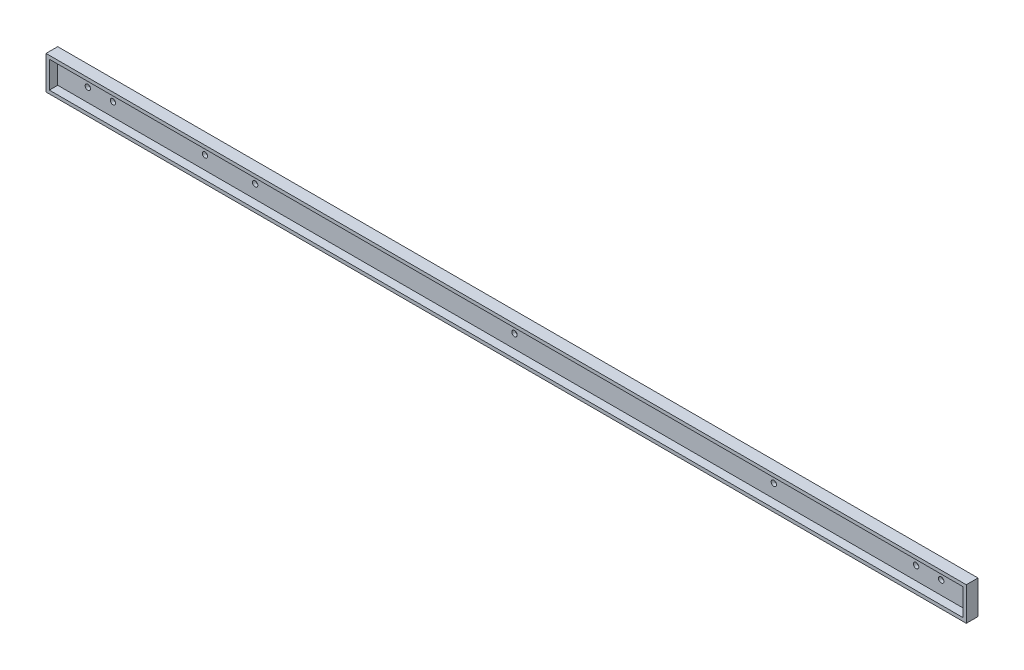
ISO-10303-21;
HEADER;
FILE_DESCRIPTION(('STEP AP214'),'2;1');
FILE_NAME('part.step','',(''),(''),'','','');
FILE_SCHEMA(('AUTOMOTIVE_DESIGN { 1 0 10303 214 1 1 1 1 }'));
ENDSEC;
DATA;
#1=APPLICATION_CONTEXT('core data for automotive mechanical design processes');
#2=APPLICATION_PROTOCOL_DEFINITION('international standard','automotive_design',2000,#1);
#3=PRODUCT_CONTEXT('',#1,'mechanical');
#4=PRODUCT('Part','Part','',(#3));
#5=PRODUCT_RELATED_PRODUCT_CATEGORY('part','',(#4));
#6=PRODUCT_DEFINITION_FORMATION('','',#4);
#7=PRODUCT_DEFINITION_CONTEXT('part definition',#1,'design');
#8=PRODUCT_DEFINITION('design','',#6,#7);
#9=PRODUCT_DEFINITION_SHAPE('','',#8);
#10=(LENGTH_UNIT() NAMED_UNIT(*) SI_UNIT(.MILLI.,.METRE.));
#11=(NAMED_UNIT(*) PLANE_ANGLE_UNIT() SI_UNIT($,.RADIAN.));
#12=(NAMED_UNIT(*) SI_UNIT($,.STERADIAN.) SOLID_ANGLE_UNIT());
#13=UNCERTAINTY_MEASURE_WITH_UNIT(LENGTH_MEASURE(1.E-05),#10,'distance_accuracy_value','');
#14=(GEOMETRIC_REPRESENTATION_CONTEXT(3) GLOBAL_UNCERTAINTY_ASSIGNED_CONTEXT((#13)) GLOBAL_UNIT_ASSIGNED_CONTEXT((#10,
#11,#12)) REPRESENTATION_CONTEXT('',''));
#15=CARTESIAN_POINT('',(0.,0.,0.));
#16=DIRECTION('',(0.,0.,1.));
#17=DIRECTION('',(1.,0.,0.));
#18=AXIS2_PLACEMENT_3D('',#15,#16,#17);
#19=CARTESIAN_POINT('',(275.,9.99999999999999,7.));
#20=DIRECTION('',(-1.,0.,0.));
#21=DIRECTION('',(0.,0.,1.));
#22=AXIS2_PLACEMENT_3D('',#19,#20,#21);
#23=PLANE('',#22);
#24=DIRECTION('',(0.,1.,0.));
#25=VECTOR('',#24,1.);
#26=CARTESIAN_POINT('',(275.,9.99999999999999,0.));
#27=LINE('',#26,#25);
#28=CARTESIAN_POINT('',(275.,-10.,0.));
#29=VERTEX_POINT('',#28);
#30=CARTESIAN_POINT('',(275.,9.99999999999999,0.));
#31=VERTEX_POINT('',#30);
#32=EDGE_CURVE('E148',#29,#31,#27,.T.);
#33=ORIENTED_EDGE('',*,*,#32,.T.);
#34=DIRECTION('',(0.,0.,-1.));
#35=VECTOR('',#34,1.);
#36=CARTESIAN_POINT('',(275.,9.99999999999999,7.));
#37=LINE('',#36,#35);
#38=CARTESIAN_POINT('',(275.,9.99999999999999,7.));
#39=VERTEX_POINT('',#38);
#40=EDGE_CURVE('E11',#39,#31,#37,.T.);
#41=ORIENTED_EDGE('',*,*,#40,.F.);
#42=DIRECTION('',(0.,1.,0.));
#43=VECTOR('',#42,1.);
#44=CARTESIAN_POINT('',(275.,9.99999999999999,7.));
#45=LINE('',#44,#43);
#46=CARTESIAN_POINT('',(275.,-10.,7.));
#47=VERTEX_POINT('',#46);
#48=EDGE_CURVE('E152',#47,#39,#45,.T.);
#49=ORIENTED_EDGE('',*,*,#48,.F.);
#50=DIRECTION('',(0.,0.,-1.));
#51=VECTOR('',#50,1.);
#52=CARTESIAN_POINT('',(275.,-10.,7.));
#53=LINE('',#52,#51);
#54=EDGE_CURVE('E158',#47,#29,#53,.T.);
#55=ORIENTED_EDGE('',*,*,#54,.T.);
#56=EDGE_LOOP('',(#33,#41,#49,#55));
#57=FACE_BOUND('',#56,.T.);
#58=ADVANCED_FACE('F34',(#57),#23,.F.);
#59=CARTESIAN_POINT('',(-275.,10.,7.));
#60=DIRECTION('',(0.,-1.,0.));
#61=DIRECTION('',(1.,0.,0.));
#62=AXIS2_PLACEMENT_3D('',#59,#60,#61);
#63=PLANE('',#62);
#64=DIRECTION('',(-1.,0.,0.));
#65=VECTOR('',#64,1.);
#66=CARTESIAN_POINT('',(-275.,10.,0.));
#67=LINE('',#66,#65);
#68=CARTESIAN_POINT('',(-275.,10.,0.));
#69=VERTEX_POINT('',#68);
#70=EDGE_CURVE('E161',#31,#69,#67,.T.);
#71=ORIENTED_EDGE('',*,*,#70,.T.);
#72=DIRECTION('',(0.,0.,-1.));
#73=VECTOR('',#72,1.);
#74=CARTESIAN_POINT('',(-275.,10.,7.));
#75=LINE('',#74,#73);
#76=CARTESIAN_POINT('',(-275.,10.,7.));
#77=VERTEX_POINT('',#76);
#78=EDGE_CURVE('E42',#77,#69,#75,.T.);
#79=ORIENTED_EDGE('',*,*,#78,.F.);
#80=DIRECTION('',(-1.,0.,0.));
#81=VECTOR('',#80,1.);
#82=CARTESIAN_POINT('',(-275.,10.,7.));
#83=LINE('',#82,#81);
#84=EDGE_CURVE('E87',#39,#77,#83,.T.);
#85=ORIENTED_EDGE('',*,*,#84,.F.);
#86=ORIENTED_EDGE('',*,*,#40,.T.);
#87=EDGE_LOOP('',(#71,#79,#85,#86));
#88=FACE_BOUND('',#87,.T.);
#89=ADVANCED_FACE('F258',(#88),#63,.F.);
#90=CARTESIAN_POINT('',(-275.,10.,7.));
#91=DIRECTION('',(1.,0.,0.));
#92=DIRECTION('',(0.,0.,-1.));
#93=AXIS2_PLACEMENT_3D('',#90,#91,#92);
#94=PLANE('',#93);
#95=DIRECTION('',(0.,-1.,0.));
#96=VECTOR('',#95,1.);
#97=CARTESIAN_POINT('',(-275.,10.,0.));
#98=LINE('',#97,#96);
#99=CARTESIAN_POINT('',(-275.,-10.,0.));
#100=VERTEX_POINT('',#99);
#101=EDGE_CURVE('E163',#69,#100,#98,.T.);
#102=ORIENTED_EDGE('',*,*,#101,.T.);
#103=DIRECTION('',(0.,0.,-1.));
#104=VECTOR('',#103,1.);
#105=CARTESIAN_POINT('',(-275.,-10.,7.));
#106=LINE('',#105,#104);
#107=CARTESIAN_POINT('',(-275.,-10.,7.));
#108=VERTEX_POINT('',#107);
#109=EDGE_CURVE('E167',#108,#100,#106,.T.);
#110=ORIENTED_EDGE('',*,*,#109,.F.);
#111=DIRECTION('',(0.,-1.,0.));
#112=VECTOR('',#111,1.);
#113=CARTESIAN_POINT('',(-275.,10.,7.));
#114=LINE('',#113,#112);
#115=EDGE_CURVE('E155',#77,#108,#114,.T.);
#116=ORIENTED_EDGE('',*,*,#115,.F.);
#117=ORIENTED_EDGE('',*,*,#78,.T.);
#118=EDGE_LOOP('',(#102,#110,#116,#117));
#119=FACE_BOUND('',#118,.T.);
#120=ADVANCED_FACE('F263',(#119),#94,.F.);
#121=CARTESIAN_POINT('',(-275.,-10.,7.));
#122=DIRECTION('',(0.,1.,0.));
#123=DIRECTION('',(0.,0.,1.));
#124=AXIS2_PLACEMENT_3D('',#121,#122,#123);
#125=PLANE('',#124);
#126=DIRECTION('',(1.,0.,0.));
#127=VECTOR('',#126,1.);
#128=CARTESIAN_POINT('',(-275.,-10.,0.));
#129=LINE('',#128,#127);
#130=EDGE_CURVE('E80',#100,#29,#129,.T.);
#131=ORIENTED_EDGE('',*,*,#130,.T.);
#132=ORIENTED_EDGE('',*,*,#54,.F.);
#133=DIRECTION('',(1.,0.,0.));
#134=VECTOR('',#133,1.);
#135=CARTESIAN_POINT('',(-275.,-10.,7.));
#136=LINE('',#135,#134);
#137=EDGE_CURVE('E59',#108,#47,#136,.T.);
#138=ORIENTED_EDGE('',*,*,#137,.F.);
#139=ORIENTED_EDGE('',*,*,#109,.T.);
#140=EDGE_LOOP('',(#131,#132,#138,#139));
#141=FACE_BOUND('',#140,.T.);
#142=ADVANCED_FACE('F275',(#141),#125,.F.);
#143=CARTESIAN_POINT('',(0.,0.,7.));
#144=DIRECTION('',(0.,0.,1.));
#145=DIRECTION('',(1.,0.,0.));
#146=AXIS2_PLACEMENT_3D('',#143,#144,#145);
#147=PLANE('',#146);
#148=DIRECTION('',(1.,0.,0.));
#149=VECTOR('',#148,1.);
#150=CARTESIAN_POINT('',(-273.,-8.00000000000001,7.));
#151=LINE('',#150,#149);
#152=CARTESIAN_POINT('',(-273.,-8.00000000000001,7.));
#153=VERTEX_POINT('',#152);
#154=CARTESIAN_POINT('',(273.,-8.00000000000001,7.));
#155=VERTEX_POINT('',#154);
#156=EDGE_CURVE('E50',#153,#155,#151,.T.);
#157=ORIENTED_EDGE('',*,*,#156,.F.);
#158=DIRECTION('',(0.,-1.,0.));
#159=VECTOR('',#158,1.);
#160=CARTESIAN_POINT('',(-273.,8.,7.));
#161=LINE('',#160,#159);
#162=CARTESIAN_POINT('',(-273.,8.,7.));
#163=VERTEX_POINT('',#162);
#164=EDGE_CURVE('E129',#163,#153,#161,.T.);
#165=ORIENTED_EDGE('',*,*,#164,.F.);
#166=DIRECTION('',(-1.,0.,0.));
#167=VECTOR('',#166,1.);
#168=CARTESIAN_POINT('',(273.,7.99999999999999,7.));
#169=LINE('',#168,#167);
#170=CARTESIAN_POINT('',(273.,7.99999999999999,7.));
#171=VERTEX_POINT('',#170);
#172=EDGE_CURVE('E132',#171,#163,#169,.T.);
#173=ORIENTED_EDGE('',*,*,#172,.F.);
#174=DIRECTION('',(0.,1.,0.));
#175=VECTOR('',#174,1.);
#176=CARTESIAN_POINT('',(273.,-8.00000000000001,7.));
#177=LINE('',#176,#175);
#178=EDGE_CURVE('E141',#155,#171,#177,.T.);
#179=ORIENTED_EDGE('',*,*,#178,.F.);
#180=EDGE_LOOP('',(#157,#165,#173,#179));
#181=FACE_BOUND('',#180,.T.);
#182=ORIENTED_EDGE('',*,*,#48,.T.);
#183=ORIENTED_EDGE('',*,*,#84,.T.);
#184=ORIENTED_EDGE('',*,*,#115,.T.);
#185=ORIENTED_EDGE('',*,*,#137,.T.);
#186=EDGE_LOOP('',(#182,#183,#184,#185));
#187=FACE_BOUND('',#186,.T.);
#188=ADVANCED_FACE('F273',(#181,#187),#147,.T.);
#189=CARTESIAN_POINT('',(0.,0.,0.));
#190=DIRECTION('',(0.,0.,1.));
#191=DIRECTION('',(1.,0.,0.));
#192=AXIS2_PLACEMENT_3D('',#189,#190,#191);
#193=PLANE('',#192);
#194=CARTESIAN_POINT('',(-185.,0.,0.));
#195=DIRECTION('',(0.,0.,-1.));
#196=DIRECTION('',(-1.,0.,0.));
#197=AXIS2_PLACEMENT_3D('',#194,#195,#196);
#198=CIRCLE('',#197,1.59999999999999);
#199=CARTESIAN_POINT('',(-186.6,0.,0.));
#200=VERTEX_POINT('',#199);
#201=EDGE_CURVE('E242',#200,#200,#198,.T.);
#202=ORIENTED_EDGE('',*,*,#201,.F.);
#203=EDGE_LOOP('',(#202));
#204=FACE_BOUND('',#203,.T.);
#205=CARTESIAN_POINT('',(-255.,0.,0.));
#206=DIRECTION('',(0.,0.,-1.));
#207=DIRECTION('',(-1.,0.,0.));
#208=AXIS2_PLACEMENT_3D('',#205,#206,#207);
#209=CIRCLE('',#208,1.59999999999996);
#210=CARTESIAN_POINT('',(-256.6,0.,0.));
#211=VERTEX_POINT('',#210);
#212=EDGE_CURVE('E175',#211,#211,#209,.T.);
#213=ORIENTED_EDGE('',*,*,#212,.F.);
#214=EDGE_LOOP('',(#213));
#215=FACE_BOUND('',#214,.T.);
#216=CARTESIAN_POINT('',(155.,0.,0.));
#217=DIRECTION('',(0.,0.,-1.));
#218=DIRECTION('',(1.,0.,0.));
#219=AXIS2_PLACEMENT_3D('',#216,#217,#218);
#220=CIRCLE('',#219,1.59999999999999);
#221=CARTESIAN_POINT('',(156.6,0.,0.));
#222=VERTEX_POINT('',#221);
#223=EDGE_CURVE('E228',#222,#222,#220,.T.);
#224=ORIENTED_EDGE('',*,*,#223,.F.);
#225=EDGE_LOOP('',(#224));
#226=FACE_BOUND('',#225,.T.);
#227=CARTESIAN_POINT('',(240.,0.,0.));
#228=DIRECTION('',(0.,0.,-1.));
#229=DIRECTION('',(1.,0.,0.));
#230=AXIS2_PLACEMENT_3D('',#227,#228,#229);
#231=CIRCLE('',#230,1.59999999999999);
#232=CARTESIAN_POINT('',(241.6,0.,0.));
#233=VERTEX_POINT('',#232);
#234=EDGE_CURVE('E234',#233,#233,#231,.T.);
#235=ORIENTED_EDGE('',*,*,#234,.F.);
#236=EDGE_LOOP('',(#235));
#237=FACE_BOUND('',#236,.T.);
#238=CARTESIAN_POINT('',(255.,0.,0.));
#239=DIRECTION('',(0.,0.,-1.));
#240=DIRECTION('',(1.,0.,0.));
#241=AXIS2_PLACEMENT_3D('',#238,#239,#240);
#242=CIRCLE('',#241,1.59999999999996);
#243=CARTESIAN_POINT('',(256.6,0.,0.));
#244=VERTEX_POINT('',#243);
#245=EDGE_CURVE('E135',#244,#244,#242,.T.);
#246=ORIENTED_EDGE('',*,*,#245,.F.);
#247=EDGE_LOOP('',(#246));
#248=FACE_BOUND('',#247,.T.);
#249=CARTESIAN_POINT('',(0.,0.,0.));
#250=DIRECTION('',(0.,0.,-1.));
#251=DIRECTION('',(-1.,0.,0.));
#252=AXIS2_PLACEMENT_3D('',#249,#250,#251);
#253=CIRCLE('',#252,1.6);
#254=CARTESIAN_POINT('',(-1.6,0.,0.));
#255=VERTEX_POINT('',#254);
#256=EDGE_CURVE('E225',#255,#255,#253,.T.);
#257=ORIENTED_EDGE('',*,*,#256,.F.);
#258=EDGE_LOOP('',(#257));
#259=FACE_BOUND('',#258,.T.);
#260=CARTESIAN_POINT('',(-155.,0.,0.));
#261=DIRECTION('',(0.,0.,-1.));
#262=DIRECTION('',(-1.,0.,0.));
#263=AXIS2_PLACEMENT_3D('',#260,#261,#262);
#264=CIRCLE('',#263,1.59999999999999);
#265=CARTESIAN_POINT('',(-156.6,0.,0.));
#266=VERTEX_POINT('',#265);
#267=EDGE_CURVE('E220',#266,#266,#264,.T.);
#268=ORIENTED_EDGE('',*,*,#267,.F.);
#269=EDGE_LOOP('',(#268));
#270=FACE_BOUND('',#269,.T.);
#271=CARTESIAN_POINT('',(-240.,0.,0.));
#272=DIRECTION('',(0.,0.,-1.));
#273=DIRECTION('',(-1.,0.,0.));
#274=AXIS2_PLACEMENT_3D('',#271,#272,#273);
#275=CIRCLE('',#274,1.59999999999999);
#276=CARTESIAN_POINT('',(-241.6,0.,0.));
#277=VERTEX_POINT('',#276);
#278=EDGE_CURVE('E218',#277,#277,#275,.T.);
#279=ORIENTED_EDGE('',*,*,#278,.F.);
#280=EDGE_LOOP('',(#279));
#281=FACE_BOUND('',#280,.T.);
#282=ORIENTED_EDGE('',*,*,#32,.F.);
#283=ORIENTED_EDGE('',*,*,#130,.F.);
#284=ORIENTED_EDGE('',*,*,#101,.F.);
#285=ORIENTED_EDGE('',*,*,#70,.F.);
#286=EDGE_LOOP('',(#282,#283,#284,#285));
#287=FACE_BOUND('',#286,.T.);
#288=ADVANCED_FACE('F268',(#204,#215,#226,#237,#248,#259,#270,#281,#287),#193,.F.);
#289=CARTESIAN_POINT('',(-273.,-8.00000000000001,2.));
#290=DIRECTION('',(0.,-1.,0.));
#291=DIRECTION('',(0.,0.,-1.));
#292=AXIS2_PLACEMENT_3D('',#289,#290,#291);
#293=PLANE('',#292);
#294=ORIENTED_EDGE('',*,*,#156,.T.);
#295=DIRECTION('',(0.,0.,1.));
#296=VECTOR('',#295,1.);
#297=CARTESIAN_POINT('',(273.,-8.00000000000001,2.));
#298=LINE('',#297,#296);
#299=CARTESIAN_POINT('',(273.,-8.00000000000001,2.));
#300=VERTEX_POINT('',#299);
#301=EDGE_CURVE('E107',#300,#155,#298,.T.);
#302=ORIENTED_EDGE('',*,*,#301,.F.);
#303=DIRECTION('',(1.,0.,0.));
#304=VECTOR('',#303,1.);
#305=CARTESIAN_POINT('',(-273.,-8.00000000000001,2.));
#306=LINE('',#305,#304);
#307=CARTESIAN_POINT('',(-273.,-8.00000000000001,2.));
#308=VERTEX_POINT('',#307);
#309=EDGE_CURVE('E111',#308,#300,#306,.T.);
#310=ORIENTED_EDGE('',*,*,#309,.F.);
#311=DIRECTION('',(0.,0.,1.));
#312=VECTOR('',#311,1.);
#313=CARTESIAN_POINT('',(-273.,-8.00000000000001,2.));
#314=LINE('',#313,#312);
#315=EDGE_CURVE('E146',#308,#153,#314,.T.);
#316=ORIENTED_EDGE('',*,*,#315,.T.);
#317=EDGE_LOOP('',(#294,#302,#310,#316));
#318=FACE_BOUND('',#317,.T.);
#319=ADVANCED_FACE('F109',(#318),#293,.F.);
#320=CARTESIAN_POINT('',(-273.,8.,2.));
#321=DIRECTION('',(-1.,0.,0.));
#322=DIRECTION('',(0.,0.,1.));
#323=AXIS2_PLACEMENT_3D('',#320,#321,#322);
#324=PLANE('',#323);
#325=ORIENTED_EDGE('',*,*,#164,.T.);
#326=ORIENTED_EDGE('',*,*,#315,.F.);
#327=DIRECTION('',(0.,-1.,0.));
#328=VECTOR('',#327,1.);
#329=CARTESIAN_POINT('',(-273.,8.,2.));
#330=LINE('',#329,#328);
#331=CARTESIAN_POINT('',(-273.,8.,2.));
#332=VERTEX_POINT('',#331);
#333=EDGE_CURVE('E117',#332,#308,#330,.T.);
#334=ORIENTED_EDGE('',*,*,#333,.F.);
#335=DIRECTION('',(0.,0.,1.));
#336=VECTOR('',#335,1.);
#337=CARTESIAN_POINT('',(-273.,8.,2.));
#338=LINE('',#337,#336);
#339=EDGE_CURVE('E149',#332,#163,#338,.T.);
#340=ORIENTED_EDGE('',*,*,#339,.T.);
#341=EDGE_LOOP('',(#325,#326,#334,#340));
#342=FACE_BOUND('',#341,.T.);
#343=ADVANCED_FACE('F311',(#342),#324,.F.);
#344=CARTESIAN_POINT('',(273.,7.99999999999999,2.));
#345=DIRECTION('',(0.,1.,0.));
#346=DIRECTION('',(-1.,0.,0.));
#347=AXIS2_PLACEMENT_3D('',#344,#345,#346);
#348=PLANE('',#347);
#349=ORIENTED_EDGE('',*,*,#172,.T.);
#350=ORIENTED_EDGE('',*,*,#339,.F.);
#351=DIRECTION('',(-1.,0.,0.));
#352=VECTOR('',#351,1.);
#353=CARTESIAN_POINT('',(273.,7.99999999999999,2.));
#354=LINE('',#353,#352);
#355=CARTESIAN_POINT('',(273.,7.99999999999999,2.));
#356=VERTEX_POINT('',#355);
#357=EDGE_CURVE('E125',#356,#332,#354,.T.);
#358=ORIENTED_EDGE('',*,*,#357,.F.);
#359=DIRECTION('',(0.,0.,1.));
#360=VECTOR('',#359,1.);
#361=CARTESIAN_POINT('',(273.,7.99999999999999,2.));
#362=LINE('',#361,#360);
#363=EDGE_CURVE('E116',#356,#171,#362,.T.);
#364=ORIENTED_EDGE('',*,*,#363,.T.);
#365=EDGE_LOOP('',(#349,#350,#358,#364));
#366=FACE_BOUND('',#365,.T.);
#367=ADVANCED_FACE('F319',(#366),#348,.F.);
#368=CARTESIAN_POINT('',(273.,-8.00000000000001,2.));
#369=DIRECTION('',(1.,0.,0.));
#370=DIRECTION('',(0.,0.,-1.));
#371=AXIS2_PLACEMENT_3D('',#368,#369,#370);
#372=PLANE('',#371);
#373=ORIENTED_EDGE('',*,*,#178,.T.);
#374=ORIENTED_EDGE('',*,*,#363,.F.);
#375=DIRECTION('',(0.,1.,0.));
#376=VECTOR('',#375,1.);
#377=CARTESIAN_POINT('',(273.,-8.00000000000001,2.));
#378=LINE('',#377,#376);
#379=EDGE_CURVE('E120',#300,#356,#378,.T.);
#380=ORIENTED_EDGE('',*,*,#379,.F.);
#381=ORIENTED_EDGE('',*,*,#301,.T.);
#382=EDGE_LOOP('',(#373,#374,#380,#381));
#383=FACE_BOUND('',#382,.T.);
#384=ADVANCED_FACE('F121',(#383),#372,.F.);
#385=CARTESIAN_POINT('',(0.,0.,2.));
#386=DIRECTION('',(0.,0.,1.));
#387=DIRECTION('',(1.,0.,0.));
#388=AXIS2_PLACEMENT_3D('',#385,#386,#387);
#389=PLANE('',#388);
#390=CARTESIAN_POINT('',(-185.,0.,2.));
#391=DIRECTION('',(0.,0.,1.));
#392=DIRECTION('',(1.,0.,0.));
#393=AXIS2_PLACEMENT_3D('',#390,#391,#392);
#394=CIRCLE('',#393,1.59999999999999);
#395=CARTESIAN_POINT('',(-183.4,0.,2.));
#396=VERTEX_POINT('',#395);
#397=EDGE_CURVE('E37',#396,#396,#394,.T.);
#398=ORIENTED_EDGE('',*,*,#397,.F.);
#399=EDGE_LOOP('',(#398));
#400=FACE_BOUND('',#399,.T.);
#401=CARTESIAN_POINT('',(-255.,0.,2.));
#402=DIRECTION('',(0.,0.,1.));
#403=DIRECTION('',(1.,0.,0.));
#404=AXIS2_PLACEMENT_3D('',#401,#402,#403);
#405=CIRCLE('',#404,1.59999999999996);
#406=CARTESIAN_POINT('',(-253.4,0.,2.));
#407=VERTEX_POINT('',#406);
#408=EDGE_CURVE('E142',#407,#407,#405,.T.);
#409=ORIENTED_EDGE('',*,*,#408,.F.);
#410=EDGE_LOOP('',(#409));
#411=FACE_BOUND('',#410,.T.);
#412=CARTESIAN_POINT('',(155.,0.,2.));
#413=DIRECTION('',(0.,0.,1.));
#414=DIRECTION('',(1.,0.,0.));
#415=AXIS2_PLACEMENT_3D('',#412,#413,#414);
#416=CIRCLE('',#415,1.59999999999999);
#417=CARTESIAN_POINT('',(156.6,0.,2.));
#418=VERTEX_POINT('',#417);
#419=EDGE_CURVE('E187',#418,#418,#416,.T.);
#420=ORIENTED_EDGE('',*,*,#419,.F.);
#421=EDGE_LOOP('',(#420));
#422=FACE_BOUND('',#421,.T.);
#423=CARTESIAN_POINT('',(240.,0.,2.));
#424=DIRECTION('',(0.,0.,1.));
#425=DIRECTION('',(1.,0.,0.));
#426=AXIS2_PLACEMENT_3D('',#423,#424,#425);
#427=CIRCLE('',#426,1.59999999999999);
#428=CARTESIAN_POINT('',(241.6,0.,2.));
#429=VERTEX_POINT('',#428);
#430=EDGE_CURVE('E184',#429,#429,#427,.T.);
#431=ORIENTED_EDGE('',*,*,#430,.F.);
#432=EDGE_LOOP('',(#431));
#433=FACE_BOUND('',#432,.T.);
#434=CARTESIAN_POINT('',(255.,0.,2.));
#435=DIRECTION('',(0.,0.,1.));
#436=DIRECTION('',(1.,0.,0.));
#437=AXIS2_PLACEMENT_3D('',#434,#435,#436);
#438=CIRCLE('',#437,1.59999999999996);
#439=CARTESIAN_POINT('',(256.6,0.,2.));
#440=VERTEX_POINT('',#439);
#441=EDGE_CURVE('E181',#440,#440,#438,.T.);
#442=ORIENTED_EDGE('',*,*,#441,.F.);
#443=EDGE_LOOP('',(#442));
#444=FACE_BOUND('',#443,.T.);
#445=CARTESIAN_POINT('',(0.,0.,2.));
#446=DIRECTION('',(0.,0.,1.));
#447=DIRECTION('',(1.,0.,0.));
#448=AXIS2_PLACEMENT_3D('',#445,#446,#447);
#449=CIRCLE('',#448,1.6);
#450=CARTESIAN_POINT('',(1.6,0.,2.));
#451=VERTEX_POINT('',#450);
#452=EDGE_CURVE('E178',#451,#451,#449,.T.);
#453=ORIENTED_EDGE('',*,*,#452,.F.);
#454=EDGE_LOOP('',(#453));
#455=FACE_BOUND('',#454,.T.);
#456=CARTESIAN_POINT('',(-155.,0.,2.));
#457=DIRECTION('',(0.,0.,1.));
#458=DIRECTION('',(1.,0.,0.));
#459=AXIS2_PLACEMENT_3D('',#456,#457,#458);
#460=CIRCLE('',#459,1.59999999999999);
#461=CARTESIAN_POINT('',(-153.4,0.,2.));
#462=VERTEX_POINT('',#461);
#463=EDGE_CURVE('E174',#462,#462,#460,.T.);
#464=ORIENTED_EDGE('',*,*,#463,.F.);
#465=EDGE_LOOP('',(#464));
#466=FACE_BOUND('',#465,.T.);
#467=CARTESIAN_POINT('',(-240.,0.,2.));
#468=DIRECTION('',(0.,0.,1.));
#469=DIRECTION('',(1.,0.,0.));
#470=AXIS2_PLACEMENT_3D('',#467,#468,#469);
#471=CIRCLE('',#470,1.59999999999999);
#472=CARTESIAN_POINT('',(-238.4,0.,2.));
#473=VERTEX_POINT('',#472);
#474=EDGE_CURVE('E171',#473,#473,#471,.T.);
#475=ORIENTED_EDGE('',*,*,#474,.F.);
#476=EDGE_LOOP('',(#475));
#477=FACE_BOUND('',#476,.T.);
#478=ORIENTED_EDGE('',*,*,#309,.T.);
#479=ORIENTED_EDGE('',*,*,#379,.T.);
#480=ORIENTED_EDGE('',*,*,#357,.T.);
#481=ORIENTED_EDGE('',*,*,#333,.T.);
#482=EDGE_LOOP('',(#478,#479,#480,#481));
#483=FACE_BOUND('',#482,.T.);
#484=ADVANCED_FACE('F127',(#400,#411,#422,#433,#444,#455,#466,#477,#483),#389,.T.);
#485=CARTESIAN_POINT('',(-240.,0.,7.));
#486=DIRECTION('',(0.,0.,-1.));
#487=DIRECTION('',(-1.,0.,0.));
#488=AXIS2_PLACEMENT_3D('',#485,#486,#487);
#489=CYLINDRICAL_SURFACE('',#488,1.59999999999999);
#490=ORIENTED_EDGE('',*,*,#474,.T.);
#491=EDGE_LOOP('',(#490));
#492=FACE_BOUND('',#491,.T.);
#493=ORIENTED_EDGE('',*,*,#278,.T.);
#494=EDGE_LOOP('',(#493));
#495=FACE_BOUND('',#494,.T.);
#496=ADVANCED_FACE('F197',(#492,#495),#489,.F.);
#497=CARTESIAN_POINT('',(-155.,0.,7.));
#498=DIRECTION('',(0.,0.,-1.));
#499=DIRECTION('',(-1.,0.,0.));
#500=AXIS2_PLACEMENT_3D('',#497,#498,#499);
#501=CYLINDRICAL_SURFACE('',#500,1.59999999999999);
#502=ORIENTED_EDGE('',*,*,#463,.T.);
#503=EDGE_LOOP('',(#502));
#504=FACE_BOUND('',#503,.T.);
#505=ORIENTED_EDGE('',*,*,#267,.T.);
#506=EDGE_LOOP('',(#505));
#507=FACE_BOUND('',#506,.T.);
#508=ADVANCED_FACE('F214',(#504,#507),#501,.F.);
#509=CARTESIAN_POINT('',(0.,0.,7.));
#510=DIRECTION('',(0.,0.,-1.));
#511=DIRECTION('',(-1.,0.,0.));
#512=AXIS2_PLACEMENT_3D('',#509,#510,#511);
#513=CYLINDRICAL_SURFACE('',#512,1.6);
#514=ORIENTED_EDGE('',*,*,#452,.T.);
#515=EDGE_LOOP('',(#514));
#516=FACE_BOUND('',#515,.T.);
#517=ORIENTED_EDGE('',*,*,#256,.T.);
#518=EDGE_LOOP('',(#517));
#519=FACE_BOUND('',#518,.T.);
#520=ADVANCED_FACE('F352',(#516,#519),#513,.F.);
#521=CARTESIAN_POINT('',(255.,0.,7.));
#522=DIRECTION('',(0.,0.,-1.));
#523=DIRECTION('',(-1.,0.,0.));
#524=AXIS2_PLACEMENT_3D('',#521,#522,#523);
#525=CYLINDRICAL_SURFACE('',#524,1.59999999999996);
#526=ORIENTED_EDGE('',*,*,#441,.T.);
#527=EDGE_LOOP('',(#526));
#528=FACE_BOUND('',#527,.T.);
#529=ORIENTED_EDGE('',*,*,#245,.T.);
#530=EDGE_LOOP('',(#529));
#531=FACE_BOUND('',#530,.T.);
#532=ADVANCED_FACE('F362',(#528,#531),#525,.F.);
#533=CARTESIAN_POINT('',(240.,0.,7.));
#534=DIRECTION('',(0.,0.,-1.));
#535=DIRECTION('',(-1.,0.,0.));
#536=AXIS2_PLACEMENT_3D('',#533,#534,#535);
#537=CYLINDRICAL_SURFACE('',#536,1.59999999999999);
#538=ORIENTED_EDGE('',*,*,#430,.T.);
#539=EDGE_LOOP('',(#538));
#540=FACE_BOUND('',#539,.T.);
#541=ORIENTED_EDGE('',*,*,#234,.T.);
#542=EDGE_LOOP('',(#541));
#543=FACE_BOUND('',#542,.T.);
#544=ADVANCED_FACE('F372',(#540,#543),#537,.F.);
#545=CARTESIAN_POINT('',(155.,0.,7.));
#546=DIRECTION('',(0.,0.,-1.));
#547=DIRECTION('',(-1.,0.,0.));
#548=AXIS2_PLACEMENT_3D('',#545,#546,#547);
#549=CYLINDRICAL_SURFACE('',#548,1.59999999999999);
#550=ORIENTED_EDGE('',*,*,#419,.T.);
#551=EDGE_LOOP('',(#550));
#552=FACE_BOUND('',#551,.T.);
#553=ORIENTED_EDGE('',*,*,#223,.T.);
#554=EDGE_LOOP('',(#553));
#555=FACE_BOUND('',#554,.T.);
#556=ADVANCED_FACE('F255',(#552,#555),#549,.F.);
#557=CARTESIAN_POINT('',(-255.,0.,7.));
#558=DIRECTION('',(0.,0.,-1.));
#559=DIRECTION('',(-1.,0.,0.));
#560=AXIS2_PLACEMENT_3D('',#557,#558,#559);
#561=CYLINDRICAL_SURFACE('',#560,1.59999999999996);
#562=ORIENTED_EDGE('',*,*,#408,.T.);
#563=EDGE_LOOP('',(#562));
#564=FACE_BOUND('',#563,.T.);
#565=ORIENTED_EDGE('',*,*,#212,.T.);
#566=EDGE_LOOP('',(#565));
#567=FACE_BOUND('',#566,.T.);
#568=ADVANCED_FACE('F192',(#564,#567),#561,.F.);
#569=CARTESIAN_POINT('',(-185.,0.,7.));
#570=DIRECTION('',(0.,0.,-1.));
#571=DIRECTION('',(-1.,0.,0.));
#572=AXIS2_PLACEMENT_3D('',#569,#570,#571);
#573=CYLINDRICAL_SURFACE('',#572,1.59999999999999);
#574=ORIENTED_EDGE('',*,*,#397,.T.);
#575=EDGE_LOOP('',(#574));
#576=FACE_BOUND('',#575,.T.);
#577=ORIENTED_EDGE('',*,*,#201,.T.);
#578=EDGE_LOOP('',(#577));
#579=FACE_BOUND('',#578,.T.);
#580=ADVANCED_FACE('F249',(#576,#579),#573,.F.);
#581=CLOSED_SHELL('',(#58,#89,#120,#142,#188,#288,#319,#343,#367,#384,#484,#496,#508,#520,#532,
#544,#556,#568,#580));
#582=MANIFOLD_SOLID_BREP('B2',#581);
#583=ADVANCED_BREP_SHAPE_REPRESENTATION('',(#18,#582),#14);
#584=SHAPE_DEFINITION_REPRESENTATION(#9,#583);
ENDSEC;
END-ISO-10303-21;
